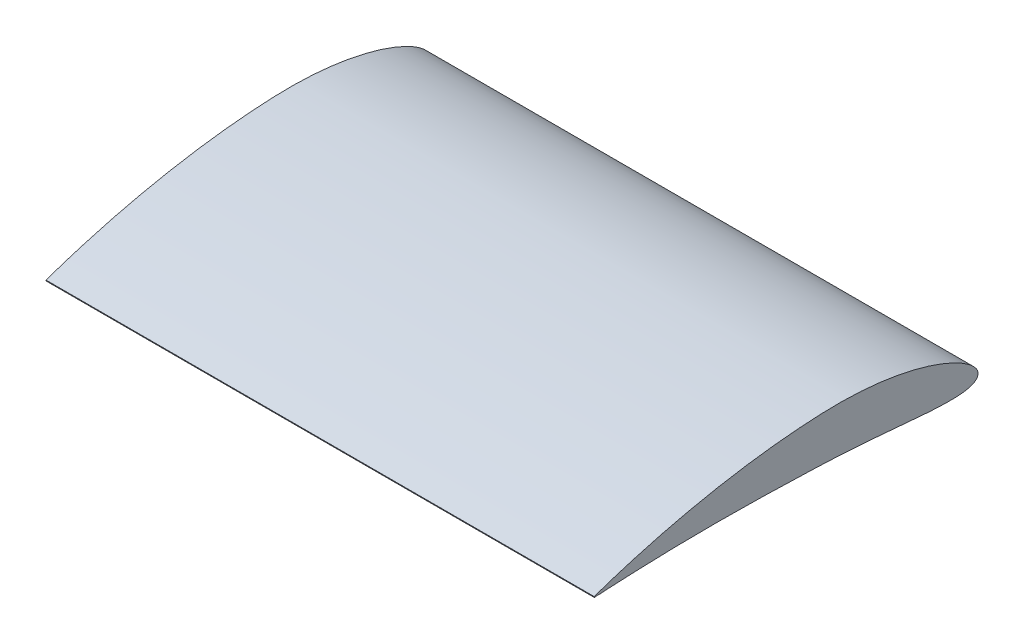
ISO-10303-21;
HEADER;
FILE_DESCRIPTION(('STEP AP214'),'2;1');
FILE_NAME('part.step','',(''),(''),'','','');
FILE_SCHEMA(('AUTOMOTIVE_DESIGN { 1 0 10303 214 1 1 1 1 }'));
ENDSEC;
DATA;
#1=APPLICATION_CONTEXT('core data for automotive mechanical design processes');
#2=APPLICATION_PROTOCOL_DEFINITION('international standard','automotive_design',2000,#1);
#3=PRODUCT_CONTEXT('',#1,'mechanical');
#4=PRODUCT('Part','Part','',(#3));
#5=PRODUCT_RELATED_PRODUCT_CATEGORY('part','',(#4));
#6=PRODUCT_DEFINITION_FORMATION('','',#4);
#7=PRODUCT_DEFINITION_CONTEXT('part definition',#1,'design');
#8=PRODUCT_DEFINITION('design','',#6,#7);
#9=PRODUCT_DEFINITION_SHAPE('','',#8);
#10=(LENGTH_UNIT() NAMED_UNIT(*) SI_UNIT(.MILLI.,.METRE.));
#11=(NAMED_UNIT(*) PLANE_ANGLE_UNIT() SI_UNIT($,.RADIAN.));
#12=(NAMED_UNIT(*) SI_UNIT($,.STERADIAN.) SOLID_ANGLE_UNIT());
#13=UNCERTAINTY_MEASURE_WITH_UNIT(LENGTH_MEASURE(1.E-05),#10,'distance_accuracy_value','');
#14=(GEOMETRIC_REPRESENTATION_CONTEXT(3) GLOBAL_UNCERTAINTY_ASSIGNED_CONTEXT((#13)) GLOBAL_UNIT_ASSIGNED_CONTEXT((#10,
#11,#12)) REPRESENTATION_CONTEXT('',''));
#15=CARTESIAN_POINT('',(0.,0.,0.));
#16=DIRECTION('',(0.,0.,1.));
#17=DIRECTION('',(1.,0.,0.));
#18=AXIS2_PLACEMENT_3D('',#15,#16,#17);
#19=CARTESIAN_POINT('',(-254.,-0.0302571964763549,354.787327227915));
#20=CARTESIAN_POINT('',(-254.,-0.202511549774369,354.777220058735));
#21=CARTESIAN_POINT('',(-254.,-0.758116619532224,354.744619463571));
#22=CARTESIAN_POINT('',(-254.,-0.0353878265544988,352.780150329408));
#23=CARTESIAN_POINT('',(-254.,-0.406394891328532,350.227621537646));
#24=CARTESIAN_POINT('',(-254.,0.191518705423128,345.076973542852));
#25=CARTESIAN_POINT('',(-254.,0.426846954997304,338.388880463138));
#26=CARTESIAN_POINT('',(-254.,0.912902226587254,329.767358245601));
#27=CARTESIAN_POINT('',(-254.,1.37107480853054,319.513378005819));
#28=CARTESIAN_POINT('',(-254.,1.85212662662604,307.681856469284));
#29=CARTESIAN_POINT('',(-254.,2.2828903737653,294.437996631764));
#30=CARTESIAN_POINT('',(-254.,2.65636592644588,279.933149694368));
#31=CARTESIAN_POINT('',(-254.,2.90744759821903,264.337268620967));
#32=CARTESIAN_POINT('',(-254.,3.02848065946825,247.830237404837));
#33=CARTESIAN_POINT('',(-254.,2.97910623211237,224.541124113717));
#34=CARTESIAN_POINT('',(-254.,2.58624656268472,200.671973719441));
#35=CARTESIAN_POINT('',(-254.,1.91789319340299,176.483884619505));
#36=CARTESIAN_POINT('',(-254.,1.28674404323604,158.296467958687));
#37=CARTESIAN_POINT('',(-254.,0.674535202653767,140.48477689744));
#38=CARTESIAN_POINT('',(-254.,-0.458414507964394,117.937239158073));
#39=CARTESIAN_POINT('',(-254.,-2.15355585803942,96.4067365521407));
#40=CARTESIAN_POINT('',(-254.,-3.98391169785236,75.9298626432168));
#41=CARTESIAN_POINT('',(-254.,-5.23803481691952,61.9523939500743));
#42=CARTESIAN_POINT('',(-254.,-6.3018667845873,49.0830780174977));
#43=CARTESIAN_POINT('',(-254.,-7.05379709208437,37.4470572233417));
#44=CARTESIAN_POINT('',(-254.,-7.40487495085787,27.1638266260831));
#45=CARTESIAN_POINT('',(-254.,-7.26852765592077,18.3491197902741));
#46=CARTESIAN_POINT('',(-254.,-6.58746462442697,11.0873159681167));
#47=CARTESIAN_POINT('',(-254.,-5.28808573883758,5.4507808849597));
#48=CARTESIAN_POINT('',(-254.,-3.30894318563573,1.35108725963543));
#49=CARTESIAN_POINT('',(-254.,-0.148325215865237,-0.987487677240321));
#50=CARTESIAN_POINT('',(-254.,3.7967578133831,-0.765838064798878));
#51=CARTESIAN_POINT('',(-254.,7.71649979382027,1.67922407257184));
#52=CARTESIAN_POINT('',(-254.,11.8553419578337,5.92689766090299));
#53=CARTESIAN_POINT('',(-254.,16.2262899348965,12.1072031542234));
#54=CARTESIAN_POINT('',(-254.,20.7343193498453,20.187014187513));
#55=CARTESIAN_POINT('',(-254.,25.2201252971746,30.130463623116));
#56=CARTESIAN_POINT('',(-254.,29.5108543834638,41.8433907768923));
#57=CARTESIAN_POINT('',(-254.,33.4329059974258,55.1997604360673));
#58=CARTESIAN_POINT('',(-254.,36.8104805743368,70.0434509571498));
#59=CARTESIAN_POINT('',(-254.,39.4786761807971,86.1884085277303));
#60=CARTESIAN_POINT('',(-254.,41.32105063238,103.42216726238));
#61=CARTESIAN_POINT('',(-254.,42.2288581946823,121.516747473044));
#62=CARTESIAN_POINT('',(-254.,42.1113766684293,140.09669102153));
#63=CARTESIAN_POINT('',(-254.,41.1132128906756,158.902335219002));
#64=CARTESIAN_POINT('',(-254.,39.0904540579609,183.961657870227));
#65=CARTESIAN_POINT('',(-254.,36.0047557168601,208.774809212926));
#66=CARTESIAN_POINT('',(-254.,31.1455287976255,238.622276389231));
#67=CARTESIAN_POINT('',(-254.,26.6515697314507,261.175777938493));
#68=CARTESIAN_POINT('',(-254.,21.7242725259394,282.422876263721));
#69=CARTESIAN_POINT('',(-254.,17.1306006385399,300.598349456261));
#70=CARTESIAN_POINT('',(-254.,11.7988919274353,319.654473711953));
#71=CARTESIAN_POINT('',(-254.,6.72155114802005,336.024074691811));
#72=CARTESIAN_POINT('',(-254.,3.49779827393597,345.800950265157));
#73=CARTESIAN_POINT('',(-254.,1.92709586834348,350.478726649503));
#74=CARTESIAN_POINT('',(-254.,0.953557869568799,353.29965963041));
#75=CARTESIAN_POINT('',(-254.,0.519388000117919,354.559877308969));
#76=CARTESIAN_POINT('',(-254.,0.410417886541196,354.876173010782));
#77=B_SPLINE_CURVE_WITH_KNOTS('',3,(#19,#20,#21,#22,#23,#24,#25,#26,#27,#28,#29,#30,#31,#32,#33,
#34,#35,#36,#37,#38,#39,#40,#41,#42,#43,#44,#45,#46,#47,#48,#49,#50,#51,#52,#53,#54,#55,#56,#57,
#58,#59,#60,#61,#62,#63,#64,#65,#66,#67,#68,#69,#70,#71,#72,#73,#74,#75,#76),.UNSPECIFIED.,.F.,
.F.,(4,1,1,1,1,1,1,1,1,1,1,1,1,1,1,1,1,1,1,1,1,1,1,1,1,1,1,1,1,1,1,1,1,1,1,1,1,1,1,1,1,1,1,1,1,
1,1,1,1,1,1,1,1,1,1,4),(0.,0.00061435602735338,0.00198160056276364,0.00606849911990259,
0.0128259983002053,0.0221600600259541,0.0339528411484215,0.0480573219049674,0.0643016527838605,
0.0824806064748046,0.102390013464696,0.123786894847983,0.146429707819126,0.170067604158041,
0.219268231220122,0.244299756437978,0.269272617042279,0.293879334559277,0.317367886846568,
0.361825599196296,0.382415541627446,0.401655123624231,0.419361860817184,0.435356743556399,
0.44945739068769,0.461534248286615,0.471483960270294,0.479298491667603,0.485175806315722,
0.489815015537041,0.49445371882196,0.500384211459872,0.508369297965653,0.518670584727767,
0.531320006060474,0.54625561026072,0.563345994084458,0.58242326585592,0.60328874622392,
0.625720296766354,0.649474912467889,0.674310012117921,0.699958821683972,0.725614899189679,
0.751503233324799,0.803021620411888,0.828087427427487,0.875472920842336,0.897280851310736,
0.917503738861992,0.952328750245583,0.978398030734231,0.987765198149775,0.994535224157492,
0.998628423374974,1.),.UNSPECIFIED.);
#78=DIRECTION('',(1.,0.,0.));
#79=VECTOR('',#78,1.);
#80=SURFACE_OF_LINEAR_EXTRUSION('',#77,#79);
#81=DIRECTION('',(1.,0.,0.));
#82=VECTOR('',#81,1.);
#83=CARTESIAN_POINT('',(-254.,0.410417886541196,354.876173010782));
#84=LINE('',#83,#82);
#85=CARTESIAN_POINT('',(-254.,0.410417886541196,354.876173010782));
#86=VERTEX_POINT('',#85);
#87=CARTESIAN_POINT('',(254.,0.410417886541196,354.876173010782));
#88=VERTEX_POINT('',#87);
#89=EDGE_CURVE('E42',#86,#88,#84,.T.);
#90=ORIENTED_EDGE('',*,*,#89,.T.);
#91=CARTESIAN_POINT('',(254.,-0.0302571964763549,354.787327227915));
#92=CARTESIAN_POINT('',(254.,-0.202511549774369,354.777220058735));
#93=CARTESIAN_POINT('',(254.,-0.758116619532224,354.744619463571));
#94=CARTESIAN_POINT('',(254.,-0.0353878265544988,352.780150329408));
#95=CARTESIAN_POINT('',(254.,-0.406394891328532,350.227621537646));
#96=CARTESIAN_POINT('',(254.,0.191518705423128,345.076973542852));
#97=CARTESIAN_POINT('',(254.,0.426846954997304,338.388880463138));
#98=CARTESIAN_POINT('',(254.,0.912902226587254,329.767358245601));
#99=CARTESIAN_POINT('',(254.,1.37107480853054,319.513378005819));
#100=CARTESIAN_POINT('',(254.,1.85212662662604,307.681856469284));
#101=CARTESIAN_POINT('',(254.,2.2828903737653,294.437996631764));
#102=CARTESIAN_POINT('',(254.,2.65636592644588,279.933149694368));
#103=CARTESIAN_POINT('',(254.,2.90744759821903,264.337268620967));
#104=CARTESIAN_POINT('',(254.,3.02848065946825,247.830237404837));
#105=CARTESIAN_POINT('',(254.,2.97910623211237,224.541124113717));
#106=CARTESIAN_POINT('',(254.,2.58624656268472,200.671973719441));
#107=CARTESIAN_POINT('',(254.,1.91789319340299,176.483884619505));
#108=CARTESIAN_POINT('',(254.,1.28674404323604,158.296467958687));
#109=CARTESIAN_POINT('',(254.,0.674535202653767,140.48477689744));
#110=CARTESIAN_POINT('',(254.,-0.458414507964394,117.937239158073));
#111=CARTESIAN_POINT('',(254.,-2.15355585803942,96.4067365521407));
#112=CARTESIAN_POINT('',(254.,-3.98391169785236,75.9298626432168));
#113=CARTESIAN_POINT('',(254.,-5.23803481691952,61.9523939500743));
#114=CARTESIAN_POINT('',(254.,-6.3018667845873,49.0830780174977));
#115=CARTESIAN_POINT('',(254.,-7.05379709208437,37.4470572233417));
#116=CARTESIAN_POINT('',(254.,-7.40487495085787,27.1638266260831));
#117=CARTESIAN_POINT('',(254.,-7.26852765592077,18.3491197902741));
#118=CARTESIAN_POINT('',(254.,-6.58746462442697,11.0873159681167));
#119=CARTESIAN_POINT('',(254.,-5.28808573883758,5.4507808849597));
#120=CARTESIAN_POINT('',(254.,-3.30894318563573,1.35108725963543));
#121=CARTESIAN_POINT('',(254.,-0.148325215865237,-0.987487677240321));
#122=CARTESIAN_POINT('',(254.,3.7967578133831,-0.765838064798878));
#123=CARTESIAN_POINT('',(254.,7.71649979382027,1.67922407257184));
#124=CARTESIAN_POINT('',(254.,11.8553419578337,5.92689766090299));
#125=CARTESIAN_POINT('',(254.,16.2262899348965,12.1072031542234));
#126=CARTESIAN_POINT('',(254.,20.7343193498453,20.187014187513));
#127=CARTESIAN_POINT('',(254.,25.2201252971746,30.130463623116));
#128=CARTESIAN_POINT('',(254.,29.5108543834638,41.8433907768923));
#129=CARTESIAN_POINT('',(254.,33.4329059974258,55.1997604360673));
#130=CARTESIAN_POINT('',(254.,36.8104805743368,70.0434509571498));
#131=CARTESIAN_POINT('',(254.,39.4786761807971,86.1884085277303));
#132=CARTESIAN_POINT('',(254.,41.32105063238,103.42216726238));
#133=CARTESIAN_POINT('',(254.,42.2288581946823,121.516747473044));
#134=CARTESIAN_POINT('',(254.,42.1113766684293,140.09669102153));
#135=CARTESIAN_POINT('',(254.,41.1132128906756,158.902335219002));
#136=CARTESIAN_POINT('',(254.,39.0904540579609,183.961657870227));
#137=CARTESIAN_POINT('',(254.,36.0047557168601,208.774809212926));
#138=CARTESIAN_POINT('',(254.,31.1455287976255,238.622276389231));
#139=CARTESIAN_POINT('',(254.,26.6515697314507,261.175777938493));
#140=CARTESIAN_POINT('',(254.,21.7242725259394,282.422876263721));
#141=CARTESIAN_POINT('',(254.,17.1306006385399,300.598349456261));
#142=CARTESIAN_POINT('',(254.,11.7988919274353,319.654473711953));
#143=CARTESIAN_POINT('',(254.,6.72155114802005,336.024074691811));
#144=CARTESIAN_POINT('',(254.,3.49779827393597,345.800950265157));
#145=CARTESIAN_POINT('',(254.,1.92709586834348,350.478726649503));
#146=CARTESIAN_POINT('',(254.,0.953557869568799,353.29965963041));
#147=CARTESIAN_POINT('',(254.,0.519388000117919,354.559877308969));
#148=CARTESIAN_POINT('',(254.,0.410417886541196,354.876173010782));
#149=B_SPLINE_CURVE_WITH_KNOTS('',3,(#91,#92,#93,#94,#95,#96,#97,#98,#99,#100,#101,#102,#103,
#104,#105,#106,#107,#108,#109,#110,#111,#112,#113,#114,#115,#116,#117,#118,#119,#120,#121,#122,
#123,#124,#125,#126,#127,#128,#129,#130,#131,#132,#133,#134,#135,#136,#137,#138,#139,#140,#141,
#142,#143,#144,#145,#146,#147,#148),.UNSPECIFIED.,.F.,.F.,(4,1,1,1,1,1,1,1,1,1,1,1,1,1,1,1,1,1,
1,1,1,1,1,1,1,1,1,1,1,1,1,1,1,1,1,1,1,1,1,1,1,1,1,1,1,1,1,1,1,1,1,1,1,1,1,4),(0.,
0.00061435602735338,0.00198160056276364,0.00606849911990259,0.0128259983002053,
0.0221600600259541,0.0339528411484215,0.0480573219049674,0.0643016527838605,0.0824806064748046,
0.102390013464696,0.123786894847983,0.146429707819126,0.170067604158041,0.219268231220122,
0.244299756437978,0.269272617042279,0.293879334559277,0.317367886846568,0.361825599196296,
0.382415541627446,0.401655123624231,0.419361860817184,0.435356743556399,0.44945739068769,
0.461534248286615,0.471483960270294,0.479298491667603,0.485175806315722,0.489815015537041,
0.49445371882196,0.500384211459872,0.508369297965653,0.518670584727767,0.531320006060474,
0.54625561026072,0.563345994084458,0.58242326585592,0.60328874622392,0.625720296766354,
0.649474912467889,0.674310012117921,0.699958821683972,0.725614899189679,0.751503233324799,
0.803021620411888,0.828087427427487,0.875472920842336,0.897280851310736,0.917503738861992,
0.952328750245583,0.978398030734231,0.987765198149775,0.994535224157492,0.998628423374974,1.),.UNSPECIFIED.);
#150=CARTESIAN_POINT('',(254.,-0.030257196476355,354.787327227915));
#151=VERTEX_POINT('',#150);
#152=EDGE_CURVE('E63',#151,#88,#149,.T.);
#153=ORIENTED_EDGE('',*,*,#152,.F.);
#154=DIRECTION('',(1.,0.,0.));
#155=VECTOR('',#154,1.);
#156=CARTESIAN_POINT('',(-254.,-0.030257196476355,354.787327227915));
#157=LINE('',#156,#155);
#158=CARTESIAN_POINT('',(-254.,-0.030257196476355,354.787327227915));
#159=VERTEX_POINT('',#158);
#160=EDGE_CURVE('E11',#159,#151,#157,.T.);
#161=ORIENTED_EDGE('',*,*,#160,.F.);
#162=EDGE_CURVE('E64',#159,#86,#77,.T.);
#163=ORIENTED_EDGE('',*,*,#162,.T.);
#164=EDGE_LOOP('',(#90,#153,#161,#163));
#165=FACE_BOUND('',#164,.T.);
#166=ADVANCED_FACE('F38',(#165),#80,.T.);
#167=CARTESIAN_POINT('',(-254.,-0.030257196476355,354.787327227915));
#168=DIRECTION('',(0.,-0.197636177726589,0.980275441523261));
#169=DIRECTION('',(0.,-0.980275441523261,-0.197636177726589));
#170=AXIS2_PLACEMENT_3D('',#167,#168,#169);
#171=PLANE('',#170);
#172=ORIENTED_EDGE('',*,*,#160,.T.);
#173=DIRECTION('',(0.,-0.980275441523261,-0.197636177726589));
#174=VECTOR('',#173,1.);
#175=CARTESIAN_POINT('',(254.,-0.030257196476355,354.787327227915));
#176=LINE('',#175,#174);
#177=EDGE_CURVE('E68',#88,#151,#176,.T.);
#178=ORIENTED_EDGE('',*,*,#177,.F.);
#179=ORIENTED_EDGE('',*,*,#89,.F.);
#180=DIRECTION('',(0.,-0.980275441523261,-0.197636177726589));
#181=VECTOR('',#180,1.);
#182=CARTESIAN_POINT('',(-254.,-0.030257196476355,354.787327227915));
#183=LINE('',#182,#181);
#184=EDGE_CURVE('E66',#86,#159,#183,.T.);
#185=ORIENTED_EDGE('',*,*,#184,.T.);
#186=EDGE_LOOP('',(#172,#178,#179,#185));
#187=FACE_BOUND('',#186,.T.);
#188=ADVANCED_FACE('F69',(#187),#171,.T.);
#189=CARTESIAN_POINT('',(-254.,6.95548452892668,1.34686834904547));
#190=DIRECTION('',(-1.,0.,0.));
#191=DIRECTION('',(0.,0.,1.));
#192=AXIS2_PLACEMENT_3D('',#189,#190,#191);
#193=PLANE('',#192);
#194=ORIENTED_EDGE('',*,*,#162,.F.);
#195=ORIENTED_EDGE('',*,*,#184,.F.);
#196=EDGE_LOOP('',(#194,#195));
#197=FACE_BOUND('',#196,.T.);
#198=ADVANCED_FACE('F87',(#197),#193,.T.);
#199=CARTESIAN_POINT('',(254.,6.95548452892668,1.34686834904547));
#200=DIRECTION('',(-1.,0.,0.));
#201=DIRECTION('',(0.,0.,1.));
#202=AXIS2_PLACEMENT_3D('',#199,#200,#201);
#203=PLANE('',#202);
#204=ORIENTED_EDGE('',*,*,#152,.T.);
#205=ORIENTED_EDGE('',*,*,#177,.T.);
#206=EDGE_LOOP('',(#204,#205));
#207=FACE_BOUND('',#206,.T.);
#208=ADVANCED_FACE('F72',(#207),#203,.F.);
#209=CLOSED_SHELL('',(#166,#188,#198,#208));
#210=MANIFOLD_SOLID_BREP('B2',#209);
#211=ADVANCED_BREP_SHAPE_REPRESENTATION('',(#18,#210),#14);
#212=SHAPE_DEFINITION_REPRESENTATION(#9,#211);
ENDSEC;
END-ISO-10303-21;
